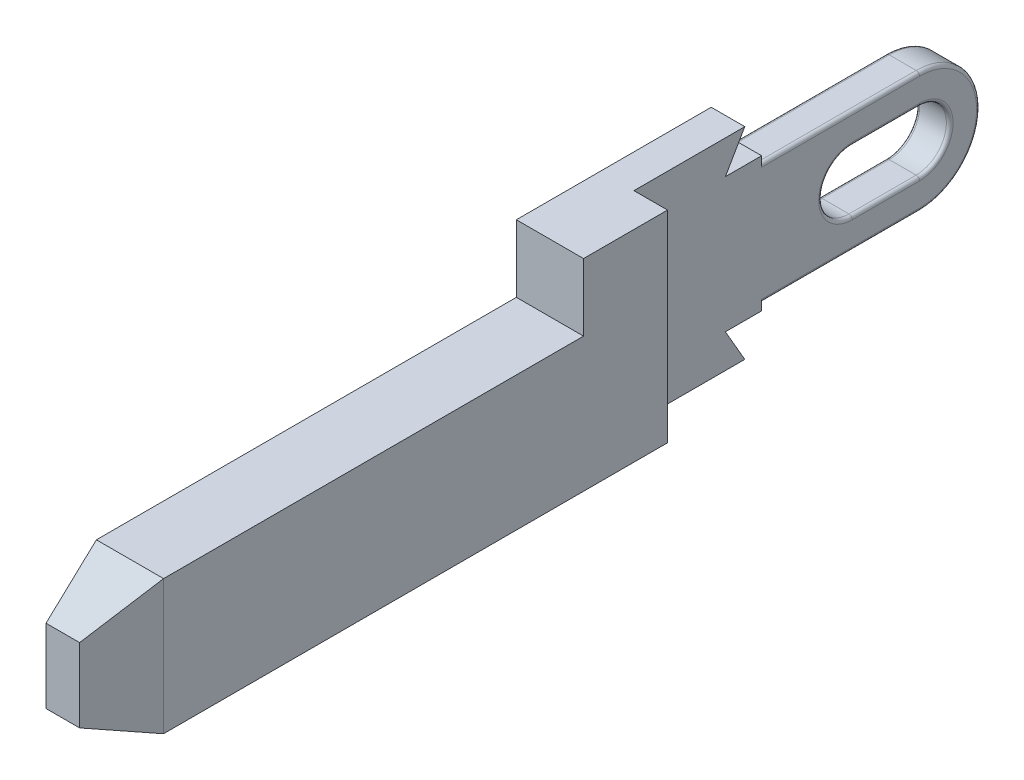
ISO-10303-21;
HEADER;
FILE_DESCRIPTION(('STEP AP214'),'2;1');
FILE_NAME('part.step','',(''),(''),'','','');
FILE_SCHEMA(('AUTOMOTIVE_DESIGN { 1 0 10303 214 1 1 1 1 }'));
ENDSEC;
DATA;
#1=APPLICATION_CONTEXT('core data for automotive mechanical design processes');
#2=APPLICATION_PROTOCOL_DEFINITION('international standard','automotive_design',2000,#1);
#3=PRODUCT_CONTEXT('',#1,'mechanical');
#4=PRODUCT('Part','Part','',(#3));
#5=PRODUCT_RELATED_PRODUCT_CATEGORY('part','',(#4));
#6=PRODUCT_DEFINITION_FORMATION('','',#4);
#7=PRODUCT_DEFINITION_CONTEXT('part definition',#1,'design');
#8=PRODUCT_DEFINITION('design','',#6,#7);
#9=PRODUCT_DEFINITION_SHAPE('','',#8);
#10=(LENGTH_UNIT() NAMED_UNIT(*) SI_UNIT(.MILLI.,.METRE.));
#11=(NAMED_UNIT(*) PLANE_ANGLE_UNIT() SI_UNIT($,.RADIAN.));
#12=(NAMED_UNIT(*) SI_UNIT($,.STERADIAN.) SOLID_ANGLE_UNIT());
#13=UNCERTAINTY_MEASURE_WITH_UNIT(LENGTH_MEASURE(1.E-05),#10,'distance_accuracy_value','');
#14=(GEOMETRIC_REPRESENTATION_CONTEXT(3) GLOBAL_UNCERTAINTY_ASSIGNED_CONTEXT((#13)) GLOBAL_UNIT_ASSIGNED_CONTEXT((#10,
#11,#12)) REPRESENTATION_CONTEXT('',''));
#15=CARTESIAN_POINT('',(0.,0.,0.));
#16=DIRECTION('',(0.,0.,1.));
#17=DIRECTION('',(1.,0.,0.));
#18=AXIS2_PLACEMENT_3D('',#15,#16,#17);
#19=CARTESIAN_POINT('',(2.,-2.,-20.3));
#20=DIRECTION('',(0.,-0.500000000000005,0.866025403784436));
#21=DIRECTION('',(0.,-0.866025403784436,-0.500000000000005));
#22=AXIS2_PLACEMENT_3D('',#19,#20,#21);
#23=PLANE('',#22);
#24=DIRECTION('',(0.,0.866025403784436,0.500000000000005));
#25=VECTOR('',#24,1.);
#26=CARTESIAN_POINT('',(1.,-2.,-20.3));
#27=LINE('',#26,#25);
#28=CARTESIAN_POINT('',(1.,-2.,-20.3));
#29=VERTEX_POINT('',#28);
#30=CARTESIAN_POINT('',(1.,-0.999999999999999,-19.7226497308104));
#31=VERTEX_POINT('',#30);
#32=EDGE_CURVE('E515',#29,#31,#27,.T.);
#33=ORIENTED_EDGE('',*,*,#32,.F.);
#34=DIRECTION('',(-1.,0.,0.));
#35=VECTOR('',#34,1.);
#36=CARTESIAN_POINT('',(2.,-2.,-20.3));
#37=LINE('',#36,#35);
#38=CARTESIAN_POINT('',(0.,-2.,-20.3));
#39=VERTEX_POINT('',#38);
#40=EDGE_CURVE('E329',#29,#39,#37,.T.);
#41=ORIENTED_EDGE('',*,*,#40,.T.);
#42=DIRECTION('',(0.,0.866025403784436,0.500000000000005));
#43=VECTOR('',#42,1.);
#44=CARTESIAN_POINT('',(0.,-2.,-20.3));
#45=LINE('',#44,#43);
#46=CARTESIAN_POINT('',(0.,-0.999999999999999,-19.7226497308104));
#47=VERTEX_POINT('',#46);
#48=EDGE_CURVE('E276',#39,#47,#45,.T.);
#49=ORIENTED_EDGE('',*,*,#48,.T.);
#50=DIRECTION('',(-1.,0.,0.));
#51=VECTOR('',#50,1.);
#52=CARTESIAN_POINT('',(2.,-0.999999999999999,-19.7226497308104));
#53=LINE('',#52,#51);
#54=EDGE_CURVE('E327',#31,#47,#53,.T.);
#55=ORIENTED_EDGE('',*,*,#54,.F.);
#56=EDGE_LOOP('',(#33,#41,#49,#55));
#57=FACE_BOUND('',#56,.T.);
#58=ADVANCED_FACE('F37',(#57),#23,.F.);
#59=CARTESIAN_POINT('',(2.,-0.999999999999999,-19.7226497308104));
#60=DIRECTION('',(0.,1.,0.));
#61=DIRECTION('',(0.,0.,1.));
#62=AXIS2_PLACEMENT_3D('',#59,#60,#61);
#63=PLANE('',#62);
#64=DIRECTION('',(0.,0.,-1.));
#65=VECTOR('',#64,1.);
#66=CARTESIAN_POINT('',(1.,-0.999999999999999,-19.7226497308104));
#67=LINE('',#66,#65);
#68=CARTESIAN_POINT('',(1.,-0.999999999999999,-20.8));
#69=VERTEX_POINT('',#68);
#70=EDGE_CURVE('E513',#31,#69,#67,.T.);
#71=ORIENTED_EDGE('',*,*,#70,.F.);
#72=ORIENTED_EDGE('',*,*,#54,.T.);
#73=DIRECTION('',(0.,0.,-1.));
#74=VECTOR('',#73,1.);
#75=CARTESIAN_POINT('',(0.,-0.999999999999999,-19.7226497308104));
#76=LINE('',#75,#74);
#77=CARTESIAN_POINT('',(0.,-0.999999999999999,-20.8));
#78=VERTEX_POINT('',#77);
#79=EDGE_CURVE('E280',#47,#78,#76,.T.);
#80=ORIENTED_EDGE('',*,*,#79,.T.);
#81=DIRECTION('',(-1.,0.,0.));
#82=VECTOR('',#81,1.);
#83=CARTESIAN_POINT('',(2.,-0.999999999999999,-20.8));
#84=LINE('',#83,#82);
#85=EDGE_CURVE('E325',#69,#78,#84,.T.);
#86=ORIENTED_EDGE('',*,*,#85,.F.);
#87=EDGE_LOOP('',(#71,#72,#80,#86));
#88=FACE_BOUND('',#87,.T.);
#89=ADVANCED_FACE('F578',(#88),#63,.F.);
#90=CARTESIAN_POINT('',(2.,-0.999999999999999,-20.8));
#91=DIRECTION('',(0.,0.,1.));
#92=DIRECTION('',(1.,0.,0.));
#93=AXIS2_PLACEMENT_3D('',#90,#91,#92);
#94=PLANE('',#93);
#95=DIRECTION('',(0.,1.,0.));
#96=VECTOR('',#95,1.);
#97=CARTESIAN_POINT('',(1.,-0.999999999999999,-20.8));
#98=LINE('',#97,#96);
#99=CARTESIAN_POINT('',(1.,-0.699999999999999,-20.8));
#100=VERTEX_POINT('',#99);
#101=EDGE_CURVE('E464',#69,#100,#98,.T.);
#102=ORIENTED_EDGE('',*,*,#101,.F.);
#103=ORIENTED_EDGE('',*,*,#85,.T.);
#104=DIRECTION('',(0.,1.,0.));
#105=VECTOR('',#104,1.);
#106=CARTESIAN_POINT('',(0.,-0.999999999999999,-20.8));
#107=LINE('',#106,#105);
#108=CARTESIAN_POINT('',(0.,-0.699999999999999,-20.8));
#109=VERTEX_POINT('',#108);
#110=EDGE_CURVE('E283',#78,#109,#107,.T.);
#111=ORIENTED_EDGE('',*,*,#110,.T.);
#112=CARTESIAN_POINT('',(0.1,-0.699999999999999,-20.8));
#113=DIRECTION('',(0.,0.,1.));
#114=DIRECTION('',(1.,0.,0.));
#115=AXIS2_PLACEMENT_3D('',#112,#113,#114);
#116=CIRCLE('',#115,0.1);
#117=CARTESIAN_POINT('',(0.1,-0.799999999999999,-20.8));
#118=VERTEX_POINT('',#117);
#119=EDGE_CURVE('E415',#109,#118,#116,.T.);
#120=ORIENTED_EDGE('',*,*,#119,.T.);
#121=DIRECTION('',(-1.,0.,0.));
#122=VECTOR('',#121,1.);
#123=CARTESIAN_POINT('',(2.,-0.799999999999999,-20.8));
#124=LINE('',#123,#122);
#125=CARTESIAN_POINT('',(0.9,-0.799999999999999,-20.8));
#126=VERTEX_POINT('',#125);
#127=EDGE_CURVE('E322',#126,#118,#124,.T.);
#128=ORIENTED_EDGE('',*,*,#127,.F.);
#129=CARTESIAN_POINT('',(0.9,-0.699999999999999,-20.8));
#130=DIRECTION('',(0.,0.,1.));
#131=DIRECTION('',(1.,0.,0.));
#132=AXIS2_PLACEMENT_3D('',#129,#130,#131);
#133=CIRCLE('',#132,0.1);
#134=EDGE_CURVE('E417',#126,#100,#133,.T.);
#135=ORIENTED_EDGE('',*,*,#134,.T.);
#136=EDGE_LOOP('',(#102,#103,#111,#120,#128,#135));
#137=FACE_BOUND('',#136,.T.);
#138=ADVANCED_FACE('F469',(#137),#94,.F.);
#139=CARTESIAN_POINT('',(2.,-0.799999999999999,-20.8));
#140=DIRECTION('',(0.,1.,0.));
#141=DIRECTION('',(0.,0.,1.));
#142=AXIS2_PLACEMENT_3D('',#139,#140,#141);
#143=PLANE('',#142);
#144=ORIENTED_EDGE('',*,*,#127,.T.);
#145=DIRECTION('',(0.,0.,-1.));
#146=VECTOR('',#145,1.);
#147=CARTESIAN_POINT('',(0.1,-0.799999999999999,-25.5));
#148=LINE('',#147,#146);
#149=CARTESIAN_POINT('',(0.1,-0.799999999999999,-25.5));
#150=VERTEX_POINT('',#149);
#151=EDGE_CURVE('E384',#118,#150,#148,.T.);
#152=ORIENTED_EDGE('',*,*,#151,.T.);
#153=DIRECTION('',(-1.,0.,0.));
#154=VECTOR('',#153,1.);
#155=CARTESIAN_POINT('',(2.,-0.799999999999999,-25.5));
#156=LINE('',#155,#154);
#157=CARTESIAN_POINT('',(0.9,-0.799999999999999,-25.5));
#158=VERTEX_POINT('',#157);
#159=EDGE_CURVE('E319',#158,#150,#156,.T.);
#160=ORIENTED_EDGE('',*,*,#159,.F.);
#161=DIRECTION('',(0.,0.,-1.));
#162=VECTOR('',#161,1.);
#163=CARTESIAN_POINT('',(0.9,-0.799999999999999,-20.8));
#164=LINE('',#163,#162);
#165=EDGE_CURVE('E382',#158,#126,#164,.F.);
#166=ORIENTED_EDGE('',*,*,#165,.T.);
#167=EDGE_LOOP('',(#144,#152,#160,#166));
#168=FACE_BOUND('',#167,.T.);
#169=ADVANCED_FACE('F474',(#168),#143,.F.);
#170=CARTESIAN_POINT('',(2.,1.,-25.5));
#171=DIRECTION('',(-1.,0.,0.));
#172=DIRECTION('',(0.,0.,1.));
#173=AXIS2_PLACEMENT_3D('',#170,#171,#172);
#174=CYLINDRICAL_SURFACE('',#173,1.8);
#175=ORIENTED_EDGE('',*,*,#159,.T.);
#176=CARTESIAN_POINT('',(0.1,1.,-25.5));
#177=DIRECTION('',(-1.,0.,0.));
#178=DIRECTION('',(0.,0.,1.));
#179=AXIS2_PLACEMENT_3D('',#176,#177,#178);
#180=CIRCLE('',#179,1.8);
#181=CARTESIAN_POINT('',(0.1,2.8,-25.5));
#182=VERTEX_POINT('',#181);
#183=EDGE_CURVE('E389',#150,#182,#180,.F.);
#184=ORIENTED_EDGE('',*,*,#183,.T.);
#185=DIRECTION('',(-1.,0.,0.));
#186=VECTOR('',#185,1.);
#187=CARTESIAN_POINT('',(2.,2.8,-25.5));
#188=LINE('',#187,#186);
#189=CARTESIAN_POINT('',(0.9,2.8,-25.5));
#190=VERTEX_POINT('',#189);
#191=EDGE_CURVE('E317',#190,#182,#188,.T.);
#192=ORIENTED_EDGE('',*,*,#191,.F.);
#193=CARTESIAN_POINT('',(0.9,1.,-25.5));
#194=DIRECTION('',(1.,0.,0.));
#195=DIRECTION('',(0.,0.,-1.));
#196=AXIS2_PLACEMENT_3D('',#193,#194,#195);
#197=CIRCLE('',#196,1.8);
#198=EDGE_CURVE('E387',#190,#158,#197,.F.);
#199=ORIENTED_EDGE('',*,*,#198,.T.);
#200=EDGE_LOOP('',(#175,#184,#192,#199));
#201=FACE_BOUND('',#200,.T.);
#202=ADVANCED_FACE('F487',(#201),#174,.T.);
#203=CARTESIAN_POINT('',(2.,2.8,-20.8));
#204=DIRECTION('',(0.,-1.,0.));
#205=DIRECTION('',(0.,0.,-1.));
#206=AXIS2_PLACEMENT_3D('',#203,#204,#205);
#207=PLANE('',#206);
#208=ORIENTED_EDGE('',*,*,#191,.T.);
#209=DIRECTION('',(0.,0.,1.));
#210=VECTOR('',#209,1.);
#211=CARTESIAN_POINT('',(0.1,2.8,-20.8));
#212=LINE('',#211,#210);
#213=CARTESIAN_POINT('',(0.1,2.8,-20.8));
#214=VERTEX_POINT('',#213);
#215=EDGE_CURVE('E54',#182,#214,#212,.T.);
#216=ORIENTED_EDGE('',*,*,#215,.T.);
#217=DIRECTION('',(-1.,0.,0.));
#218=VECTOR('',#217,1.);
#219=CARTESIAN_POINT('',(2.,2.8,-20.8));
#220=LINE('',#219,#218);
#221=CARTESIAN_POINT('',(0.9,2.8,-20.8));
#222=VERTEX_POINT('',#221);
#223=EDGE_CURVE('E315',#222,#214,#220,.T.);
#224=ORIENTED_EDGE('',*,*,#223,.F.);
#225=DIRECTION('',(0.,0.,1.));
#226=VECTOR('',#225,1.);
#227=CARTESIAN_POINT('',(0.9,2.8,-25.5));
#228=LINE('',#227,#226);
#229=EDGE_CURVE('E412',#222,#190,#228,.F.);
#230=ORIENTED_EDGE('',*,*,#229,.T.);
#231=EDGE_LOOP('',(#208,#216,#224,#230));
#232=FACE_BOUND('',#231,.T.);
#233=ADVANCED_FACE('F488',(#232),#207,.F.);
#234=CARTESIAN_POINT('',(2.,3.,-20.8));
#235=DIRECTION('',(0.,0.,1.));
#236=DIRECTION('',(1.,0.,0.));
#237=AXIS2_PLACEMENT_3D('',#234,#235,#236);
#238=PLANE('',#237);
#239=DIRECTION('',(0.,1.,0.));
#240=VECTOR('',#239,1.);
#241=CARTESIAN_POINT('',(1.,3.,-20.8));
#242=LINE('',#241,#240);
#243=CARTESIAN_POINT('',(1.,2.7,-20.8));
#244=VERTEX_POINT('',#243);
#245=CARTESIAN_POINT('',(1.,3.,-20.8));
#246=VERTEX_POINT('',#245);
#247=EDGE_CURVE('E461',#244,#246,#242,.T.);
#248=ORIENTED_EDGE('',*,*,#247,.F.);
#249=CARTESIAN_POINT('',(0.9,2.7,-20.8));
#250=DIRECTION('',(0.,0.,1.));
#251=DIRECTION('',(1.,0.,0.));
#252=AXIS2_PLACEMENT_3D('',#249,#250,#251);
#253=CIRCLE('',#252,0.1);
#254=EDGE_CURVE('E11',#244,#222,#253,.T.);
#255=ORIENTED_EDGE('',*,*,#254,.T.);
#256=ORIENTED_EDGE('',*,*,#223,.T.);
#257=CARTESIAN_POINT('',(0.1,2.7,-20.8));
#258=DIRECTION('',(0.,0.,1.));
#259=DIRECTION('',(1.,0.,0.));
#260=AXIS2_PLACEMENT_3D('',#257,#258,#259);
#261=CIRCLE('',#260,0.1);
#262=CARTESIAN_POINT('',(0.,2.7,-20.8));
#263=VERTEX_POINT('',#262);
#264=EDGE_CURVE('E46',#214,#263,#261,.T.);
#265=ORIENTED_EDGE('',*,*,#264,.T.);
#266=DIRECTION('',(0.,1.,0.));
#267=VECTOR('',#266,1.);
#268=CARTESIAN_POINT('',(0.,3.,-20.8));
#269=LINE('',#268,#267);
#270=CARTESIAN_POINT('',(0.,3.,-20.8));
#271=VERTEX_POINT('',#270);
#272=EDGE_CURVE('E285',#263,#271,#269,.T.);
#273=ORIENTED_EDGE('',*,*,#272,.T.);
#274=DIRECTION('',(-1.,0.,0.));
#275=VECTOR('',#274,1.);
#276=CARTESIAN_POINT('',(2.,3.,-20.8));
#277=LINE('',#276,#275);
#278=EDGE_CURVE('E313',#246,#271,#277,.T.);
#279=ORIENTED_EDGE('',*,*,#278,.F.);
#280=EDGE_LOOP('',(#248,#255,#256,#265,#273,#279));
#281=FACE_BOUND('',#280,.T.);
#282=ADVANCED_FACE('F493',(#281),#238,.F.);
#283=CARTESIAN_POINT('',(2.,3.,-19.7226497308104));
#284=DIRECTION('',(0.,-1.,0.));
#285=DIRECTION('',(0.,0.,-1.));
#286=AXIS2_PLACEMENT_3D('',#283,#284,#285);
#287=PLANE('',#286);
#288=DIRECTION('',(0.,0.,1.));
#289=VECTOR('',#288,1.);
#290=CARTESIAN_POINT('',(1.,3.,-19.7226497308104));
#291=LINE('',#290,#289);
#292=CARTESIAN_POINT('',(1.,3.,-19.7226497308104));
#293=VERTEX_POINT('',#292);
#294=EDGE_CURVE('E503',#246,#293,#291,.T.);
#295=ORIENTED_EDGE('',*,*,#294,.F.);
#296=ORIENTED_EDGE('',*,*,#278,.T.);
#297=DIRECTION('',(0.,0.,1.));
#298=VECTOR('',#297,1.);
#299=CARTESIAN_POINT('',(0.,3.,-19.7226497308104));
#300=LINE('',#299,#298);
#301=CARTESIAN_POINT('',(0.,3.,-19.7226497308104));
#302=VERTEX_POINT('',#301);
#303=EDGE_CURVE('E288',#271,#302,#300,.T.);
#304=ORIENTED_EDGE('',*,*,#303,.T.);
#305=DIRECTION('',(-1.,0.,0.));
#306=VECTOR('',#305,1.);
#307=CARTESIAN_POINT('',(2.,3.,-19.7226497308104));
#308=LINE('',#307,#306);
#309=EDGE_CURVE('E311',#293,#302,#308,.T.);
#310=ORIENTED_EDGE('',*,*,#309,.F.);
#311=EDGE_LOOP('',(#295,#296,#304,#310));
#312=FACE_BOUND('',#311,.T.);
#313=ADVANCED_FACE('F502',(#312),#287,.F.);
#314=CARTESIAN_POINT('',(2.,4.,-20.3));
#315=DIRECTION('',(0.,0.500000000000005,0.866025403784436));
#316=DIRECTION('',(0.,-0.866025403784436,0.500000000000005));
#317=AXIS2_PLACEMENT_3D('',#314,#315,#316);
#318=PLANE('',#317);
#319=DIRECTION('',(0.,0.866025403784436,-0.500000000000005));
#320=VECTOR('',#319,1.);
#321=CARTESIAN_POINT('',(1.,4.,-20.3));
#322=LINE('',#321,#320);
#323=CARTESIAN_POINT('',(1.,4.,-20.3));
#324=VERTEX_POINT('',#323);
#325=EDGE_CURVE('E505',#293,#324,#322,.T.);
#326=ORIENTED_EDGE('',*,*,#325,.F.);
#327=ORIENTED_EDGE('',*,*,#309,.T.);
#328=DIRECTION('',(0.,0.866025403784436,-0.500000000000005));
#329=VECTOR('',#328,1.);
#330=CARTESIAN_POINT('',(0.,4.,-20.3));
#331=LINE('',#330,#329);
#332=CARTESIAN_POINT('',(0.,4.,-20.3));
#333=VERTEX_POINT('',#332);
#334=EDGE_CURVE('E291',#302,#333,#331,.T.);
#335=ORIENTED_EDGE('',*,*,#334,.T.);
#336=DIRECTION('',(-1.,0.,0.));
#337=VECTOR('',#336,1.);
#338=CARTESIAN_POINT('',(2.,4.,-20.3));
#339=LINE('',#338,#337);
#340=EDGE_CURVE('E309',#324,#333,#339,.T.);
#341=ORIENTED_EDGE('',*,*,#340,.F.);
#342=EDGE_LOOP('',(#326,#327,#335,#341));
#343=FACE_BOUND('',#342,.T.);
#344=ADVANCED_FACE('F795',(#343),#318,.F.);
#345=CARTESIAN_POINT('',(2.,1.,-23.5));
#346=DIRECTION('',(-1.,0.,0.));
#347=DIRECTION('',(0.,0.,1.));
#348=AXIS2_PLACEMENT_3D('',#345,#346,#347);
#349=CYLINDRICAL_SURFACE('',#348,0.9);
#350=DIRECTION('',(-1.,0.,0.));
#351=VECTOR('',#350,1.);
#352=CARTESIAN_POINT('',(2.,0.100000000000001,-23.5));
#353=LINE('',#352,#351);
#354=CARTESIAN_POINT('',(0.9,0.100000000000001,-23.5));
#355=VERTEX_POINT('',#354);
#356=CARTESIAN_POINT('',(0.1,0.100000000000001,-23.5));
#357=VERTEX_POINT('',#356);
#358=EDGE_CURVE('E277',#355,#357,#353,.T.);
#359=ORIENTED_EDGE('',*,*,#358,.T.);
#360=CARTESIAN_POINT('',(0.1,1.,-23.5));
#361=DIRECTION('',(-1.,0.,0.));
#362=DIRECTION('',(0.,0.,1.));
#363=AXIS2_PLACEMENT_3D('',#360,#361,#362);
#364=CIRCLE('',#363,0.9);
#365=CARTESIAN_POINT('',(0.1,1.9,-23.5));
#366=VERTEX_POINT('',#365);
#367=EDGE_CURVE('E371',#357,#366,#364,.T.);
#368=ORIENTED_EDGE('',*,*,#367,.T.);
#369=DIRECTION('',(-1.,0.,0.));
#370=VECTOR('',#369,1.);
#371=CARTESIAN_POINT('',(2.,1.9,-23.5));
#372=LINE('',#371,#370);
#373=CARTESIAN_POINT('',(0.9,1.9,-23.5));
#374=VERTEX_POINT('',#373);
#375=EDGE_CURVE('E521',#374,#366,#372,.T.);
#376=ORIENTED_EDGE('',*,*,#375,.F.);
#377=CARTESIAN_POINT('',(0.9,1.,-23.5));
#378=DIRECTION('',(1.,0.,0.));
#379=DIRECTION('',(0.,0.,-1.));
#380=AXIS2_PLACEMENT_3D('',#377,#378,#379);
#381=CIRCLE('',#380,0.9);
#382=EDGE_CURVE('E368',#374,#355,#381,.T.);
#383=ORIENTED_EDGE('',*,*,#382,.T.);
#384=EDGE_LOOP('',(#359,#368,#376,#383));
#385=FACE_BOUND('',#384,.T.);
#386=ADVANCED_FACE('F533',(#385),#349,.F.);
#387=CARTESIAN_POINT('',(2.,0.100000000000001,-23.5));
#388=DIRECTION('',(0.,1.,0.));
#389=DIRECTION('',(0.,0.,1.));
#390=AXIS2_PLACEMENT_3D('',#387,#388,#389);
#391=PLANE('',#390);
#392=DIRECTION('',(-1.,0.,0.));
#393=VECTOR('',#392,1.);
#394=CARTESIAN_POINT('',(2.,0.100000000000001,-25.5));
#395=LINE('',#394,#393);
#396=CARTESIAN_POINT('',(0.9,0.100000000000001,-25.5));
#397=VERTEX_POINT('',#396);
#398=CARTESIAN_POINT('',(0.1,0.100000000000001,-25.5));
#399=VERTEX_POINT('',#398);
#400=EDGE_CURVE('E527',#397,#399,#395,.T.);
#401=ORIENTED_EDGE('',*,*,#400,.T.);
#402=DIRECTION('',(0.,0.,-1.));
#403=VECTOR('',#402,1.);
#404=CARTESIAN_POINT('',(0.1,0.100000000000001,-23.5));
#405=LINE('',#404,#403);
#406=EDGE_CURVE('E410',#399,#357,#405,.F.);
#407=ORIENTED_EDGE('',*,*,#406,.T.);
#408=ORIENTED_EDGE('',*,*,#358,.F.);
#409=DIRECTION('',(0.,0.,-1.));
#410=VECTOR('',#409,1.);
#411=CARTESIAN_POINT('',(0.9,0.100000000000001,-23.5));
#412=LINE('',#411,#410);
#413=EDGE_CURVE('E408',#355,#397,#412,.T.);
#414=ORIENTED_EDGE('',*,*,#413,.T.);
#415=EDGE_LOOP('',(#401,#407,#408,#414));
#416=FACE_BOUND('',#415,.T.);
#417=ADVANCED_FACE('F810',(#416),#391,.T.);
#418=CARTESIAN_POINT('',(2.,1.,-25.5));
#419=DIRECTION('',(-1.,0.,0.));
#420=DIRECTION('',(0.,0.,1.));
#421=AXIS2_PLACEMENT_3D('',#418,#419,#420);
#422=CYLINDRICAL_SURFACE('',#421,0.9);
#423=DIRECTION('',(-1.,0.,0.));
#424=VECTOR('',#423,1.);
#425=CARTESIAN_POINT('',(2.,1.9,-25.5));
#426=LINE('',#425,#424);
#427=CARTESIAN_POINT('',(0.9,1.9,-25.5));
#428=VERTEX_POINT('',#427);
#429=CARTESIAN_POINT('',(0.1,1.9,-25.5));
#430=VERTEX_POINT('',#429);
#431=EDGE_CURVE('E524',#428,#430,#426,.T.);
#432=ORIENTED_EDGE('',*,*,#431,.T.);
#433=CARTESIAN_POINT('',(0.1,1.,-25.5));
#434=DIRECTION('',(-1.,0.,0.));
#435=DIRECTION('',(0.,0.,1.));
#436=AXIS2_PLACEMENT_3D('',#433,#434,#435);
#437=CIRCLE('',#436,0.9);
#438=EDGE_CURVE('E380',#430,#399,#437,.T.);
#439=ORIENTED_EDGE('',*,*,#438,.T.);
#440=ORIENTED_EDGE('',*,*,#400,.F.);
#441=CARTESIAN_POINT('',(0.9,1.,-25.5));
#442=DIRECTION('',(1.,0.,0.));
#443=DIRECTION('',(0.,0.,-1.));
#444=AXIS2_PLACEMENT_3D('',#441,#442,#443);
#445=CIRCLE('',#444,0.9);
#446=EDGE_CURVE('E378',#397,#428,#445,.T.);
#447=ORIENTED_EDGE('',*,*,#446,.T.);
#448=EDGE_LOOP('',(#432,#439,#440,#447));
#449=FACE_BOUND('',#448,.T.);
#450=ADVANCED_FACE('F560',(#449),#422,.F.);
#451=CARTESIAN_POINT('',(2.,1.9,-23.5));
#452=DIRECTION('',(0.,-1.,0.));
#453=DIRECTION('',(0.,0.,-1.));
#454=AXIS2_PLACEMENT_3D('',#451,#452,#453);
#455=PLANE('',#454);
#456=ORIENTED_EDGE('',*,*,#375,.T.);
#457=DIRECTION('',(0.,0.,1.));
#458=VECTOR('',#457,1.);
#459=CARTESIAN_POINT('',(0.1,1.9,-23.5));
#460=LINE('',#459,#458);
#461=EDGE_CURVE('E376',#366,#430,#460,.F.);
#462=ORIENTED_EDGE('',*,*,#461,.T.);
#463=ORIENTED_EDGE('',*,*,#431,.F.);
#464=DIRECTION('',(0.,0.,1.));
#465=VECTOR('',#464,1.);
#466=CARTESIAN_POINT('',(0.9,1.9,-23.5));
#467=LINE('',#466,#465);
#468=EDGE_CURVE('E374',#428,#374,#467,.T.);
#469=ORIENTED_EDGE('',*,*,#468,.T.);
#470=EDGE_LOOP('',(#456,#462,#463,#469));
#471=FACE_BOUND('',#470,.T.);
#472=ADVANCED_FACE('F556',(#471),#455,.T.);
#473=CARTESIAN_POINT('',(2.,1.,-25.5));
#474=DIRECTION('',(-1.,0.,0.));
#475=DIRECTION('',(0.,0.,1.));
#476=AXIS2_PLACEMENT_3D('',#473,#474,#475);
#477=PLANE('',#476);
#478=DIRECTION('',(0.,0.,1.));
#479=VECTOR('',#478,1.);
#480=CARTESIAN_POINT('',(2.,2.,-2.));
#481=LINE('',#480,#479);
#482=CARTESIAN_POINT('',(2.,2.,-14.5));
#483=VERTEX_POINT('',#482);
#484=CARTESIAN_POINT('',(2.,2.,-2.));
#485=VERTEX_POINT('',#484);
#486=EDGE_CURVE('E265',#483,#485,#481,.T.);
#487=ORIENTED_EDGE('',*,*,#486,.T.);
#488=DIRECTION('',(0.,-1.,0.));
#489=VECTOR('',#488,1.);
#490=CARTESIAN_POINT('',(2.,1.,-2.00000000000003));
#491=LINE('',#490,#489);
#492=CARTESIAN_POINT('',(2.,-2.,-2.));
#493=VERTEX_POINT('',#492);
#494=EDGE_CURVE('E245',#485,#493,#491,.T.);
#495=ORIENTED_EDGE('',*,*,#494,.T.);
#496=DIRECTION('',(0.,0.,-1.));
#497=VECTOR('',#496,1.);
#498=CARTESIAN_POINT('',(2.,-2.,-2.));
#499=LINE('',#498,#497);
#500=CARTESIAN_POINT('',(2.,-2.,-17.));
#501=VERTEX_POINT('',#500);
#502=EDGE_CURVE('E256',#493,#501,#499,.T.);
#503=ORIENTED_EDGE('',*,*,#502,.T.);
#504=DIRECTION('',(0.,-1.,0.));
#505=VECTOR('',#504,1.);
#506=CARTESIAN_POINT('',(2.,5.63012774019272,-17.));
#507=LINE('',#506,#505);
#508=CARTESIAN_POINT('',(2.,4.,-17.));
#509=VERTEX_POINT('',#508);
#510=EDGE_CURVE('E238',#509,#501,#507,.T.);
#511=ORIENTED_EDGE('',*,*,#510,.F.);
#512=DIRECTION('',(0.,0.,1.));
#513=VECTOR('',#512,1.);
#514=CARTESIAN_POINT('',(2.,4.,-14.5));
#515=LINE('',#514,#513);
#516=CARTESIAN_POINT('',(2.,4.,-14.5));
#517=VERTEX_POINT('',#516);
#518=EDGE_CURVE('E252',#509,#517,#515,.T.);
#519=ORIENTED_EDGE('',*,*,#518,.T.);
#520=DIRECTION('',(0.,-1.,0.));
#521=VECTOR('',#520,1.);
#522=CARTESIAN_POINT('',(2.,2.,-14.5));
#523=LINE('',#522,#521);
#524=EDGE_CURVE('E263',#517,#483,#523,.T.);
#525=ORIENTED_EDGE('',*,*,#524,.T.);
#526=EDGE_LOOP('',(#487,#495,#503,#511,#519,#525));
#527=FACE_BOUND('',#526,.T.);
#528=ADVANCED_FACE('F251',(#527),#477,.F.);
#529=CARTESIAN_POINT('',(0.,1.,-25.5));
#530=DIRECTION('',(-1.,0.,0.));
#531=DIRECTION('',(0.,0.,1.));
#532=AXIS2_PLACEMENT_3D('',#529,#530,#531);
#533=PLANE('',#532);
#534=DIRECTION('',(0.,0.,1.));
#535=VECTOR('',#534,1.);
#536=CARTESIAN_POINT('',(0.,2.,-25.5));
#537=LINE('',#536,#535);
#538=CARTESIAN_POINT('',(0.,2.,-25.5));
#539=VERTEX_POINT('',#538);
#540=CARTESIAN_POINT('',(0.,2.,-23.5));
#541=VERTEX_POINT('',#540);
#542=EDGE_CURVE('E363',#539,#541,#537,.T.);
#543=ORIENTED_EDGE('',*,*,#542,.T.);
#544=CARTESIAN_POINT('',(0.,1.,-23.5));
#545=DIRECTION('',(-1.,0.,0.));
#546=DIRECTION('',(0.,0.,1.));
#547=AXIS2_PLACEMENT_3D('',#544,#545,#546);
#548=CIRCLE('',#547,1.);
#549=CARTESIAN_POINT('',(0.,0.,-23.5));
#550=VERTEX_POINT('',#549);
#551=EDGE_CURVE('E365',#541,#550,#548,.F.);
#552=ORIENTED_EDGE('',*,*,#551,.T.);
#553=DIRECTION('',(0.,0.,-1.));
#554=VECTOR('',#553,1.);
#555=CARTESIAN_POINT('',(0.,0.,-25.5));
#556=LINE('',#555,#554);
#557=CARTESIAN_POINT('',(0.,0.,-25.5));
#558=VERTEX_POINT('',#557);
#559=EDGE_CURVE('E359',#550,#558,#556,.T.);
#560=ORIENTED_EDGE('',*,*,#559,.T.);
#561=CARTESIAN_POINT('',(0.,1.,-25.5));
#562=DIRECTION('',(-1.,0.,0.));
#563=DIRECTION('',(0.,0.,1.));
#564=AXIS2_PLACEMENT_3D('',#561,#562,#563);
#565=CIRCLE('',#564,1.);
#566=EDGE_CURVE('E361',#558,#539,#565,.F.);
#567=ORIENTED_EDGE('',*,*,#566,.T.);
#568=EDGE_LOOP('',(#543,#552,#560,#567));
#569=FACE_BOUND('',#568,.T.);
#570=DIRECTION('',(0.,0.,-1.));
#571=VECTOR('',#570,1.);
#572=CARTESIAN_POINT('',(0.,-0.699999999999999,-20.8));
#573=LINE('',#572,#571);
#574=CARTESIAN_POINT('',(0.,-0.699999999999999,-25.5));
#575=VERTEX_POINT('',#574);
#576=EDGE_CURVE('E356',#575,#109,#573,.F.);
#577=ORIENTED_EDGE('',*,*,#576,.T.);
#578=ORIENTED_EDGE('',*,*,#110,.F.);
#579=ORIENTED_EDGE('',*,*,#79,.F.);
#580=ORIENTED_EDGE('',*,*,#48,.F.);
#581=DIRECTION('',(0.,0.,-1.));
#582=VECTOR('',#581,1.);
#583=CARTESIAN_POINT('',(0.,-2.,-2.));
#584=LINE('',#583,#582);
#585=CARTESIAN_POINT('',(0.,-2.,-2.));
#586=VERTEX_POINT('',#585);
#587=EDGE_CURVE('E273',#586,#39,#584,.T.);
#588=ORIENTED_EDGE('',*,*,#587,.F.);
#589=DIRECTION('',(0.,1.,0.));
#590=VECTOR('',#589,1.);
#591=CARTESIAN_POINT('',(0.,1.1,-2.00000000000003));
#592=LINE('',#591,#590);
#593=CARTESIAN_POINT('',(0.,2.,-2.));
#594=VERTEX_POINT('',#593);
#595=EDGE_CURVE('E348',#586,#594,#592,.T.);
#596=ORIENTED_EDGE('',*,*,#595,.T.);
#597=DIRECTION('',(0.,0.,1.));
#598=VECTOR('',#597,1.);
#599=CARTESIAN_POINT('',(0.,2.,-2.));
#600=LINE('',#599,#598);
#601=CARTESIAN_POINT('',(0.,2.,-14.5));
#602=VERTEX_POINT('',#601);
#603=EDGE_CURVE('E267',#602,#594,#600,.T.);
#604=ORIENTED_EDGE('',*,*,#603,.F.);
#605=DIRECTION('',(0.,-1.,0.));
#606=VECTOR('',#605,1.);
#607=CARTESIAN_POINT('',(0.,2.,-14.5));
#608=LINE('',#607,#606);
#609=CARTESIAN_POINT('',(0.,4.,-14.5));
#610=VERTEX_POINT('',#609);
#611=EDGE_CURVE('E296',#610,#602,#608,.T.);
#612=ORIENTED_EDGE('',*,*,#611,.F.);
#613=DIRECTION('',(0.,0.,1.));
#614=VECTOR('',#613,1.);
#615=CARTESIAN_POINT('',(0.,4.,-14.5));
#616=LINE('',#615,#614);
#617=EDGE_CURVE('E294',#333,#610,#616,.T.);
#618=ORIENTED_EDGE('',*,*,#617,.F.);
#619=ORIENTED_EDGE('',*,*,#334,.F.);
#620=ORIENTED_EDGE('',*,*,#303,.F.);
#621=ORIENTED_EDGE('',*,*,#272,.F.);
#622=DIRECTION('',(0.,0.,1.));
#623=VECTOR('',#622,1.);
#624=CARTESIAN_POINT('',(0.,2.7,-25.5));
#625=LINE('',#624,#623);
#626=CARTESIAN_POINT('',(0.,2.7,-25.5));
#627=VERTEX_POINT('',#626);
#628=EDGE_CURVE('E352',#263,#627,#625,.F.);
#629=ORIENTED_EDGE('',*,*,#628,.T.);
#630=CARTESIAN_POINT('',(0.,1.,-25.5));
#631=DIRECTION('',(-1.,0.,0.));
#632=DIRECTION('',(0.,0.,1.));
#633=AXIS2_PLACEMENT_3D('',#630,#631,#632);
#634=CIRCLE('',#633,1.7);
#635=EDGE_CURVE('E354',#627,#575,#634,.T.);
#636=ORIENTED_EDGE('',*,*,#635,.T.);
#637=EDGE_LOOP('',(#577,#578,#579,#580,#588,#596,#604,#612,#618,#619,#620,#621,#629,#636));
#638=FACE_BOUND('',#637,.T.);
#639=ADVANCED_FACE('F498',(#569,#638),#533,.T.);
#640=CARTESIAN_POINT('',(2.,-1.1,0.));
#641=DIRECTION('',(0.,0.911921505175107,-0.410364677328798));
#642=DIRECTION('',(0.,0.410364677328798,0.911921505175107));
#643=AXIS2_PLACEMENT_3D('',#640,#641,#642);
#644=PLANE('',#643);
#645=DIRECTION('',(-1.,0.,0.));
#646=VECTOR('',#645,1.);
#647=CARTESIAN_POINT('',(2.,-1.1,0.));
#648=LINE('',#647,#646);
#649=CARTESIAN_POINT('',(1.5,-1.1,0.));
#650=VERTEX_POINT('',#649);
#651=CARTESIAN_POINT('',(0.5,-1.1,0.));
#652=VERTEX_POINT('',#651);
#653=EDGE_CURVE('E246',#650,#652,#648,.T.);
#654=ORIENTED_EDGE('',*,*,#653,.T.);
#655=DIRECTION('',(-0.222277112237191,-0.400098802026949,-0.889108448948775));
#656=VECTOR('',#655,1.);
#657=CARTESIAN_POINT('',(0.597826086956521,-0.923913043478261,0.391304347826087));
#658=LINE('',#657,#656);
#659=EDGE_CURVE('E346',#652,#586,#658,.T.);
#660=ORIENTED_EDGE('',*,*,#659,.T.);
#661=DIRECTION('',(-1.,0.,0.));
#662=VECTOR('',#661,1.);
#663=CARTESIAN_POINT('',(2.,-2.,-2.));
#664=LINE('',#663,#662);
#665=EDGE_CURVE('E331',#493,#586,#664,.T.);
#666=ORIENTED_EDGE('',*,*,#665,.F.);
#667=DIRECTION('',(0.222277112237191,-0.400098802026949,-0.889108448948775));
#668=VECTOR('',#667,1.);
#669=CARTESIAN_POINT('',(1.73320158102767,-1.51976284584981,-0.932806324110695));
#670=LINE('',#669,#668);
#671=EDGE_CURVE('E337',#493,#650,#670,.F.);
#672=ORIENTED_EDGE('',*,*,#671,.T.);
#673=EDGE_LOOP('',(#654,#660,#666,#672));
#674=FACE_BOUND('',#673,.T.);
#675=ADVANCED_FACE('F592',(#674),#644,.F.);
#676=CARTESIAN_POINT('',(2.,-2.,-2.));
#677=DIRECTION('',(0.,1.,0.));
#678=DIRECTION('',(0.,0.,1.));
#679=AXIS2_PLACEMENT_3D('',#676,#677,#678);
#680=PLANE('',#679);
#681=DIRECTION('',(0.,0.,-1.));
#682=VECTOR('',#681,1.);
#683=CARTESIAN_POINT('',(1.,-2.,-2.));
#684=LINE('',#683,#682);
#685=CARTESIAN_POINT('',(1.,-2.,-17.));
#686=VERTEX_POINT('',#685);
#687=EDGE_CURVE('E517',#686,#29,#684,.T.);
#688=ORIENTED_EDGE('',*,*,#687,.F.);
#689=DIRECTION('',(1.,0.,0.));
#690=VECTOR('',#689,1.);
#691=CARTESIAN_POINT('',(2.,-2.,-17.));
#692=LINE('',#691,#690);
#693=EDGE_CURVE('E519',#686,#501,#692,.T.);
#694=ORIENTED_EDGE('',*,*,#693,.T.);
#695=ORIENTED_EDGE('',*,*,#502,.F.);
#696=ORIENTED_EDGE('',*,*,#665,.T.);
#697=ORIENTED_EDGE('',*,*,#587,.T.);
#698=ORIENTED_EDGE('',*,*,#40,.F.);
#699=EDGE_LOOP('',(#688,#694,#695,#696,#697,#698));
#700=FACE_BOUND('',#699,.T.);
#701=ADVANCED_FACE('F589',(#700),#680,.F.);
#702=CARTESIAN_POINT('',(2.,4.,-14.5));
#703=DIRECTION('',(0.,-1.,0.));
#704=DIRECTION('',(0.,0.,-1.));
#705=AXIS2_PLACEMENT_3D('',#702,#703,#704);
#706=PLANE('',#705);
#707=ORIENTED_EDGE('',*,*,#518,.F.);
#708=DIRECTION('',(-1.,0.,0.));
#709=VECTOR('',#708,1.);
#710=CARTESIAN_POINT('',(2.,4.,-17.));
#711=LINE('',#710,#709);
#712=CARTESIAN_POINT('',(1.,4.,-17.));
#713=VERTEX_POINT('',#712);
#714=EDGE_CURVE('E235',#509,#713,#711,.T.);
#715=ORIENTED_EDGE('',*,*,#714,.T.);
#716=DIRECTION('',(0.,0.,1.));
#717=VECTOR('',#716,1.);
#718=CARTESIAN_POINT('',(1.,4.,-14.5));
#719=LINE('',#718,#717);
#720=EDGE_CURVE('E508',#324,#713,#719,.T.);
#721=ORIENTED_EDGE('',*,*,#720,.F.);
#722=ORIENTED_EDGE('',*,*,#340,.T.);
#723=ORIENTED_EDGE('',*,*,#617,.T.);
#724=DIRECTION('',(-1.,0.,0.));
#725=VECTOR('',#724,1.);
#726=CARTESIAN_POINT('',(2.,4.,-14.5));
#727=LINE('',#726,#725);
#728=EDGE_CURVE('E261',#517,#610,#727,.T.);
#729=ORIENTED_EDGE('',*,*,#728,.F.);
#730=EDGE_LOOP('',(#707,#715,#721,#722,#723,#729));
#731=FACE_BOUND('',#730,.T.);
#732=ADVANCED_FACE('F259',(#731),#706,.F.);
#733=CARTESIAN_POINT('',(2.,2.,-14.5));
#734=DIRECTION('',(0.,0.,-1.));
#735=DIRECTION('',(-1.,0.,0.));
#736=AXIS2_PLACEMENT_3D('',#733,#734,#735);
#737=PLANE('',#736);
#738=ORIENTED_EDGE('',*,*,#611,.T.);
#739=DIRECTION('',(-1.,0.,0.));
#740=VECTOR('',#739,1.);
#741=CARTESIAN_POINT('',(2.,2.,-14.5));
#742=LINE('',#741,#740);
#743=EDGE_CURVE('E305',#483,#602,#742,.T.);
#744=ORIENTED_EDGE('',*,*,#743,.F.);
#745=ORIENTED_EDGE('',*,*,#524,.F.);
#746=ORIENTED_EDGE('',*,*,#728,.T.);
#747=EDGE_LOOP('',(#738,#744,#745,#746));
#748=FACE_BOUND('',#747,.T.);
#749=ADVANCED_FACE('F860',(#748),#737,.F.);
#750=CARTESIAN_POINT('',(2.,2.,-2.));
#751=DIRECTION('',(0.,-1.,0.));
#752=DIRECTION('',(0.,0.,-1.));
#753=AXIS2_PLACEMENT_3D('',#750,#751,#752);
#754=PLANE('',#753);
#755=ORIENTED_EDGE('',*,*,#603,.T.);
#756=DIRECTION('',(-1.,0.,0.));
#757=VECTOR('',#756,1.);
#758=CARTESIAN_POINT('',(2.,2.,-2.));
#759=LINE('',#758,#757);
#760=EDGE_CURVE('E302',#485,#594,#759,.T.);
#761=ORIENTED_EDGE('',*,*,#760,.F.);
#762=ORIENTED_EDGE('',*,*,#486,.F.);
#763=ORIENTED_EDGE('',*,*,#743,.T.);
#764=EDGE_LOOP('',(#755,#761,#762,#763));
#765=FACE_BOUND('',#764,.T.);
#766=ADVANCED_FACE('F850',(#765),#754,.F.);
#767=CARTESIAN_POINT('',(2.,1.1,0.));
#768=DIRECTION('',(0.,-0.911921505175107,-0.410364677328798));
#769=DIRECTION('',(0.,0.410364677328798,-0.911921505175107));
#770=AXIS2_PLACEMENT_3D('',#767,#768,#769);
#771=PLANE('',#770);
#772=ORIENTED_EDGE('',*,*,#760,.T.);
#773=DIRECTION('',(0.222277112237191,-0.400098802026949,0.889108448948775));
#774=VECTOR('',#773,1.);
#775=CARTESIAN_POINT('',(0.597826086956521,0.923913043478261,0.391304347826087));
#776=LINE('',#775,#774);
#777=CARTESIAN_POINT('',(0.5,1.1,0.));
#778=VERTEX_POINT('',#777);
#779=EDGE_CURVE('E350',#594,#778,#776,.T.);
#780=ORIENTED_EDGE('',*,*,#779,.T.);
#781=DIRECTION('',(-1.,0.,0.));
#782=VECTOR('',#781,1.);
#783=CARTESIAN_POINT('',(2.,1.1,0.));
#784=LINE('',#783,#782);
#785=CARTESIAN_POINT('',(1.5,1.1,0.));
#786=VERTEX_POINT('',#785);
#787=EDGE_CURVE('E272',#786,#778,#784,.T.);
#788=ORIENTED_EDGE('',*,*,#787,.F.);
#789=DIRECTION('',(-0.222277112237191,-0.400098802026949,0.889108448948775));
#790=VECTOR('',#789,1.);
#791=CARTESIAN_POINT('',(1.91106719367589,1.83992094861661,-1.64426877470358));
#792=LINE('',#791,#790);
#793=EDGE_CURVE('E341',#786,#485,#792,.F.);
#794=ORIENTED_EDGE('',*,*,#793,.T.);
#795=EDGE_LOOP('',(#772,#780,#788,#794));
#796=FACE_BOUND('',#795,.T.);
#797=ADVANCED_FACE('F838',(#796),#771,.F.);
#798=CARTESIAN_POINT('',(2.,0.,0.));
#799=DIRECTION('',(0.,0.,-1.));
#800=DIRECTION('',(-1.,0.,0.));
#801=AXIS2_PLACEMENT_3D('',#798,#799,#800);
#802=PLANE('',#801);
#803=ORIENTED_EDGE('',*,*,#787,.T.);
#804=DIRECTION('',(0.,-1.,0.));
#805=VECTOR('',#804,1.);
#806=CARTESIAN_POINT('',(0.5,-1.1,0.));
#807=LINE('',#806,#805);
#808=EDGE_CURVE('E343',#778,#652,#807,.T.);
#809=ORIENTED_EDGE('',*,*,#808,.T.);
#810=ORIENTED_EDGE('',*,*,#653,.F.);
#811=DIRECTION('',(0.,1.,0.));
#812=VECTOR('',#811,1.);
#813=CARTESIAN_POINT('',(1.5,0.,0.));
#814=LINE('',#813,#812);
#815=EDGE_CURVE('E339',#650,#786,#814,.T.);
#816=ORIENTED_EDGE('',*,*,#815,.T.);
#817=EDGE_LOOP('',(#803,#809,#810,#816));
#818=FACE_BOUND('',#817,.T.);
#819=ADVANCED_FACE('F742',(#818),#802,.F.);
#820=CARTESIAN_POINT('',(1.,5.63012774019272,-17.));
#821=DIRECTION('',(0.,0.,1.));
#822=DIRECTION('',(1.,0.,0.));
#823=AXIS2_PLACEMENT_3D('',#820,#821,#822);
#824=PLANE('',#823);
#825=DIRECTION('',(0.,-1.,0.));
#826=VECTOR('',#825,1.);
#827=CARTESIAN_POINT('',(1.,5.63012774019272,-17.));
#828=LINE('',#827,#826);
#829=EDGE_CURVE('E241',#713,#686,#828,.T.);
#830=ORIENTED_EDGE('',*,*,#829,.F.);
#831=ORIENTED_EDGE('',*,*,#714,.F.);
#832=ORIENTED_EDGE('',*,*,#510,.T.);
#833=ORIENTED_EDGE('',*,*,#693,.F.);
#834=EDGE_LOOP('',(#830,#831,#832,#833));
#835=FACE_BOUND('',#834,.T.);
#836=ADVANCED_FACE('F237',(#835),#824,.F.);
#837=CARTESIAN_POINT('',(1.,0.,0.));
#838=DIRECTION('',(1.,0.,0.));
#839=DIRECTION('',(0.,0.,-1.));
#840=AXIS2_PLACEMENT_3D('',#837,#838,#839);
#841=PLANE('',#840);
#842=DIRECTION('',(0.,0.,-1.));
#843=VECTOR('',#842,1.);
#844=CARTESIAN_POINT('',(1.,0.,0.));
#845=LINE('',#844,#843);
#846=CARTESIAN_POINT('',(1.,0.,-25.5));
#847=VERTEX_POINT('',#846);
#848=CARTESIAN_POINT('',(1.,0.,-23.5));
#849=VERTEX_POINT('',#848);
#850=EDGE_CURVE('E399',#847,#849,#845,.F.);
#851=ORIENTED_EDGE('',*,*,#850,.T.);
#852=CARTESIAN_POINT('',(1.,1.,-23.5));
#853=DIRECTION('',(1.,0.,0.));
#854=DIRECTION('',(0.,0.,-1.));
#855=AXIS2_PLACEMENT_3D('',#852,#853,#854);
#856=CIRCLE('',#855,1.);
#857=CARTESIAN_POINT('',(1.,2.,-23.5));
#858=VERTEX_POINT('',#857);
#859=EDGE_CURVE('E405',#849,#858,#856,.F.);
#860=ORIENTED_EDGE('',*,*,#859,.T.);
#861=DIRECTION('',(0.,0.,1.));
#862=VECTOR('',#861,1.);
#863=CARTESIAN_POINT('',(1.,2.,0.));
#864=LINE('',#863,#862);
#865=CARTESIAN_POINT('',(1.,2.,-25.5));
#866=VERTEX_POINT('',#865);
#867=EDGE_CURVE('E403',#858,#866,#864,.F.);
#868=ORIENTED_EDGE('',*,*,#867,.T.);
#869=CARTESIAN_POINT('',(1.,1.,-25.5));
#870=DIRECTION('',(1.,0.,0.));
#871=DIRECTION('',(0.,0.,-1.));
#872=AXIS2_PLACEMENT_3D('',#869,#870,#871);
#873=CIRCLE('',#872,1.);
#874=EDGE_CURVE('E401',#866,#847,#873,.F.);
#875=ORIENTED_EDGE('',*,*,#874,.T.);
#876=EDGE_LOOP('',(#851,#860,#868,#875));
#877=FACE_BOUND('',#876,.T.);
#878=ORIENTED_EDGE('',*,*,#101,.T.);
#879=DIRECTION('',(0.,0.,-1.));
#880=VECTOR('',#879,1.);
#881=CARTESIAN_POINT('',(1.,-0.699999999999999,-25.5));
#882=LINE('',#881,#880);
#883=CARTESIAN_POINT('',(1.,-0.699999999999999,-25.5));
#884=VERTEX_POINT('',#883);
#885=EDGE_CURVE('E396',#100,#884,#882,.T.);
#886=ORIENTED_EDGE('',*,*,#885,.T.);
#887=CARTESIAN_POINT('',(1.,1.,-25.5));
#888=DIRECTION('',(1.,0.,0.));
#889=DIRECTION('',(0.,0.,-1.));
#890=AXIS2_PLACEMENT_3D('',#887,#888,#889);
#891=CIRCLE('',#890,1.7);
#892=CARTESIAN_POINT('',(1.,2.7,-25.5));
#893=VERTEX_POINT('',#892);
#894=EDGE_CURVE('E394',#884,#893,#891,.T.);
#895=ORIENTED_EDGE('',*,*,#894,.T.);
#896=DIRECTION('',(0.,0.,1.));
#897=VECTOR('',#896,1.);
#898=CARTESIAN_POINT('',(1.,2.7,-20.8));
#899=LINE('',#898,#897);
#900=EDGE_CURVE('E391',#893,#244,#899,.T.);
#901=ORIENTED_EDGE('',*,*,#900,.T.);
#902=ORIENTED_EDGE('',*,*,#247,.T.);
#903=ORIENTED_EDGE('',*,*,#294,.T.);
#904=ORIENTED_EDGE('',*,*,#325,.T.);
#905=ORIENTED_EDGE('',*,*,#720,.T.);
#906=ORIENTED_EDGE('',*,*,#829,.T.);
#907=ORIENTED_EDGE('',*,*,#687,.T.);
#908=ORIENTED_EDGE('',*,*,#32,.T.);
#909=ORIENTED_EDGE('',*,*,#70,.T.);
#910=EDGE_LOOP('',(#878,#886,#895,#901,#902,#903,#904,#905,#906,#907,#908,#909));
#911=FACE_BOUND('',#910,.T.);
#912=ADVANCED_FACE('F460',(#877,#911),#841,.T.);
#913=CARTESIAN_POINT('',(2.,1.,-2.00000000000003));
#914=DIRECTION('',(-0.970142500145333,0.,-0.24253562503633));
#915=DIRECTION('',(0.,-1.,0.));
#916=AXIS2_PLACEMENT_3D('',#913,#914,#915);
#917=PLANE('',#916);
#918=ORIENTED_EDGE('',*,*,#793,.F.);
#919=ORIENTED_EDGE('',*,*,#815,.F.);
#920=ORIENTED_EDGE('',*,*,#671,.F.);
#921=ORIENTED_EDGE('',*,*,#494,.F.);
#922=EDGE_LOOP('',(#918,#919,#920,#921));
#923=FACE_BOUND('',#922,.T.);
#924=ADVANCED_FACE('F573',(#923),#917,.F.);
#925=CARTESIAN_POINT('',(0.5,0.,0.));
#926=DIRECTION('',(-0.970142500145333,0.,0.24253562503633));
#927=DIRECTION('',(0.,1.,0.));
#928=AXIS2_PLACEMENT_3D('',#925,#926,#927);
#929=PLANE('',#928);
#930=ORIENTED_EDGE('',*,*,#779,.F.);
#931=ORIENTED_EDGE('',*,*,#595,.F.);
#932=ORIENTED_EDGE('',*,*,#659,.F.);
#933=ORIENTED_EDGE('',*,*,#808,.F.);
#934=EDGE_LOOP('',(#930,#931,#932,#933));
#935=FACE_BOUND('',#934,.T.);
#936=ADVANCED_FACE('F566',(#935),#929,.T.);
#937=CARTESIAN_POINT('',(0.1,1.,-25.5));
#938=DIRECTION('',(-1.,0.,0.));
#939=DIRECTION('',(0.,0.,1.));
#940=AXIS2_PLACEMENT_3D('',#937,#938,#939);
#941=TOROIDAL_SURFACE('',#940,1.,0.1);
#942=CARTESIAN_POINT('',(0.1,0.,-25.5));
#943=DIRECTION('',(0.,0.,1.));
#944=DIRECTION('',(1.,0.,0.));
#945=AXIS2_PLACEMENT_3D('',#942,#943,#944);
#946=CIRCLE('',#945,0.1);
#947=EDGE_CURVE('E427',#399,#558,#946,.T.);
#948=ORIENTED_EDGE('',*,*,#947,.F.);
#949=ORIENTED_EDGE('',*,*,#438,.F.);
#950=CARTESIAN_POINT('',(0.1,2.,-25.5));
#951=DIRECTION('',(0.,0.,1.));
#952=DIRECTION('',(1.,0.,0.));
#953=AXIS2_PLACEMENT_3D('',#950,#951,#952);
#954=CIRCLE('',#953,0.1);
#955=EDGE_CURVE('E257',#539,#430,#954,.T.);
#956=ORIENTED_EDGE('',*,*,#955,.F.);
#957=ORIENTED_EDGE('',*,*,#566,.F.);
#958=EDGE_LOOP('',(#948,#949,#956,#957));
#959=FACE_BOUND('',#958,.T.);
#960=ADVANCED_FACE('F564',(#959),#941,.T.);
#961=CARTESIAN_POINT('',(0.1,2.,-25.5));
#962=DIRECTION('',(0.,0.,1.));
#963=DIRECTION('',(0.,-1.,0.));
#964=AXIS2_PLACEMENT_3D('',#961,#962,#963);
#965=CYLINDRICAL_SURFACE('',#964,0.1);
#966=ORIENTED_EDGE('',*,*,#955,.T.);
#967=ORIENTED_EDGE('',*,*,#461,.F.);
#968=CARTESIAN_POINT('',(0.1,2.,-23.5));
#969=DIRECTION('',(0.,0.,1.));
#970=DIRECTION('',(1.,0.,0.));
#971=AXIS2_PLACEMENT_3D('',#968,#969,#970);
#972=CIRCLE('',#971,0.1);
#973=EDGE_CURVE('E424',#541,#366,#972,.T.);
#974=ORIENTED_EDGE('',*,*,#973,.F.);
#975=ORIENTED_EDGE('',*,*,#542,.F.);
#976=EDGE_LOOP('',(#966,#967,#974,#975));
#977=FACE_BOUND('',#976,.T.);
#978=ADVANCED_FACE('F553',(#977),#965,.T.);
#979=CARTESIAN_POINT('',(0.1,0.,-25.5));
#980=DIRECTION('',(0.,0.,-1.));
#981=DIRECTION('',(-1.,0.,0.));
#982=AXIS2_PLACEMENT_3D('',#979,#980,#981);
#983=CYLINDRICAL_SURFACE('',#982,0.1);
#984=ORIENTED_EDGE('',*,*,#947,.T.);
#985=ORIENTED_EDGE('',*,*,#559,.F.);
#986=CARTESIAN_POINT('',(0.1,0.,-23.5));
#987=DIRECTION('',(0.,0.,1.));
#988=DIRECTION('',(1.,0.,0.));
#989=AXIS2_PLACEMENT_3D('',#986,#987,#988);
#990=CIRCLE('',#989,0.1);
#991=EDGE_CURVE('E422',#357,#550,#990,.T.);
#992=ORIENTED_EDGE('',*,*,#991,.F.);
#993=ORIENTED_EDGE('',*,*,#406,.F.);
#994=EDGE_LOOP('',(#984,#985,#992,#993));
#995=FACE_BOUND('',#994,.T.);
#996=ADVANCED_FACE('F546',(#995),#983,.T.);
#997=CARTESIAN_POINT('',(0.1,1.,-23.5));
#998=DIRECTION('',(-1.,0.,0.));
#999=DIRECTION('',(0.,0.,1.));
#1000=AXIS2_PLACEMENT_3D('',#997,#998,#999);
#1001=TOROIDAL_SURFACE('',#1000,1.,0.1);
#1002=ORIENTED_EDGE('',*,*,#973,.T.);
#1003=ORIENTED_EDGE('',*,*,#367,.F.);
#1004=ORIENTED_EDGE('',*,*,#991,.T.);
#1005=ORIENTED_EDGE('',*,*,#551,.F.);
#1006=EDGE_LOOP('',(#1002,#1003,#1004,#1005));
#1007=FACE_BOUND('',#1006,.T.);
#1008=ADVANCED_FACE('F539',(#1007),#1001,.T.);
#1009=CARTESIAN_POINT('',(0.1,2.7,-20.8));
#1010=DIRECTION('',(0.,0.,-1.));
#1011=DIRECTION('',(-1.,0.,0.));
#1012=AXIS2_PLACEMENT_3D('',#1009,#1010,#1011);
#1013=CYLINDRICAL_SURFACE('',#1012,0.1);
#1014=ORIENTED_EDGE('',*,*,#264,.F.);
#1015=ORIENTED_EDGE('',*,*,#215,.F.);
#1016=CARTESIAN_POINT('',(0.1,2.7,-25.5));
#1017=DIRECTION('',(0.,0.,-1.));
#1018=DIRECTION('',(-1.,0.,0.));
#1019=AXIS2_PLACEMENT_3D('',#1016,#1017,#1018);
#1020=CIRCLE('',#1019,0.1);
#1021=EDGE_CURVE('E425',#627,#182,#1020,.T.);
#1022=ORIENTED_EDGE('',*,*,#1021,.F.);
#1023=ORIENTED_EDGE('',*,*,#628,.F.);
#1024=EDGE_LOOP('',(#1014,#1015,#1022,#1023));
#1025=FACE_BOUND('',#1024,.T.);
#1026=ADVANCED_FACE('F491',(#1025),#1013,.T.);
#1027=CARTESIAN_POINT('',(0.1,1.,-25.5));
#1028=DIRECTION('',(-1.,0.,0.));
#1029=DIRECTION('',(0.,0.,1.));
#1030=AXIS2_PLACEMENT_3D('',#1027,#1028,#1029);
#1031=TOROIDAL_SURFACE('',#1030,1.7,0.1);
#1032=ORIENTED_EDGE('',*,*,#1021,.T.);
#1033=ORIENTED_EDGE('',*,*,#183,.F.);
#1034=CARTESIAN_POINT('',(0.1,-0.699999999999999,-25.5));
#1035=DIRECTION('',(0.,0.,1.));
#1036=DIRECTION('',(1.,0.,0.));
#1037=AXIS2_PLACEMENT_3D('',#1034,#1035,#1036);
#1038=CIRCLE('',#1037,0.1);
#1039=EDGE_CURVE('E432',#575,#150,#1038,.T.);
#1040=ORIENTED_EDGE('',*,*,#1039,.F.);
#1041=ORIENTED_EDGE('',*,*,#635,.F.);
#1042=EDGE_LOOP('',(#1032,#1033,#1040,#1041));
#1043=FACE_BOUND('',#1042,.T.);
#1044=ADVANCED_FACE('F483',(#1043),#1031,.T.);
#1045=CARTESIAN_POINT('',(0.1,-0.699999999999999,-20.8));
#1046=DIRECTION('',(0.,0.,1.));
#1047=DIRECTION('',(1.,0.,0.));
#1048=AXIS2_PLACEMENT_3D('',#1045,#1046,#1047);
#1049=CYLINDRICAL_SURFACE('',#1048,0.1);
#1050=ORIENTED_EDGE('',*,*,#119,.F.);
#1051=ORIENTED_EDGE('',*,*,#576,.F.);
#1052=ORIENTED_EDGE('',*,*,#1039,.T.);
#1053=ORIENTED_EDGE('',*,*,#151,.F.);
#1054=EDGE_LOOP('',(#1050,#1051,#1052,#1053));
#1055=FACE_BOUND('',#1054,.T.);
#1056=ADVANCED_FACE('F477',(#1055),#1049,.T.);
#1057=CARTESIAN_POINT('',(0.9,1.,-25.5));
#1058=DIRECTION('',(1.,0.,0.));
#1059=DIRECTION('',(0.,0.,-1.));
#1060=AXIS2_PLACEMENT_3D('',#1057,#1058,#1059);
#1061=TOROIDAL_SURFACE('',#1060,1.,0.1);
#1062=CARTESIAN_POINT('',(0.9,0.,-25.5));
#1063=DIRECTION('',(0.,0.,1.));
#1064=DIRECTION('',(1.,0.,0.));
#1065=AXIS2_PLACEMENT_3D('',#1062,#1063,#1064);
#1066=CIRCLE('',#1065,0.1);
#1067=EDGE_CURVE('E441',#847,#397,#1066,.T.);
#1068=ORIENTED_EDGE('',*,*,#1067,.F.);
#1069=ORIENTED_EDGE('',*,*,#874,.F.);
#1070=CARTESIAN_POINT('',(0.9,2.,-25.5));
#1071=DIRECTION('',(0.,0.,1.));
#1072=DIRECTION('',(1.,0.,0.));
#1073=AXIS2_PLACEMENT_3D('',#1070,#1071,#1072);
#1074=CIRCLE('',#1073,0.1);
#1075=EDGE_CURVE('E434',#428,#866,#1074,.T.);
#1076=ORIENTED_EDGE('',*,*,#1075,.F.);
#1077=ORIENTED_EDGE('',*,*,#446,.F.);
#1078=EDGE_LOOP('',(#1068,#1069,#1076,#1077));
#1079=FACE_BOUND('',#1078,.T.);
#1080=ADVANCED_FACE('F629',(#1079),#1061,.T.);
#1081=CARTESIAN_POINT('',(0.9,2.,-23.5));
#1082=DIRECTION('',(0.,0.,1.));
#1083=DIRECTION('',(0.,-1.,0.));
#1084=AXIS2_PLACEMENT_3D('',#1081,#1082,#1083);
#1085=CYLINDRICAL_SURFACE('',#1084,0.1);
#1086=ORIENTED_EDGE('',*,*,#1075,.T.);
#1087=ORIENTED_EDGE('',*,*,#867,.F.);
#1088=CARTESIAN_POINT('',(0.9,2.,-23.5));
#1089=DIRECTION('',(0.,0.,1.));
#1090=DIRECTION('',(1.,0.,0.));
#1091=AXIS2_PLACEMENT_3D('',#1088,#1089,#1090);
#1092=CIRCLE('',#1091,0.1);
#1093=EDGE_CURVE('E439',#374,#858,#1092,.T.);
#1094=ORIENTED_EDGE('',*,*,#1093,.F.);
#1095=ORIENTED_EDGE('',*,*,#468,.F.);
#1096=EDGE_LOOP('',(#1086,#1087,#1094,#1095));
#1097=FACE_BOUND('',#1096,.T.);
#1098=ADVANCED_FACE('F635',(#1097),#1085,.T.);
#1099=CARTESIAN_POINT('',(0.9,0.,-23.5));
#1100=DIRECTION('',(0.,0.,-1.));
#1101=DIRECTION('',(-1.,0.,0.));
#1102=AXIS2_PLACEMENT_3D('',#1099,#1100,#1101);
#1103=CYLINDRICAL_SURFACE('',#1102,0.1);
#1104=ORIENTED_EDGE('',*,*,#1067,.T.);
#1105=ORIENTED_EDGE('',*,*,#413,.F.);
#1106=CARTESIAN_POINT('',(0.9,0.,-23.5));
#1107=DIRECTION('',(0.,0.,1.));
#1108=DIRECTION('',(1.,0.,0.));
#1109=AXIS2_PLACEMENT_3D('',#1106,#1107,#1108);
#1110=CIRCLE('',#1109,0.1);
#1111=EDGE_CURVE('E437',#849,#355,#1110,.T.);
#1112=ORIENTED_EDGE('',*,*,#1111,.F.);
#1113=ORIENTED_EDGE('',*,*,#850,.F.);
#1114=EDGE_LOOP('',(#1104,#1105,#1112,#1113));
#1115=FACE_BOUND('',#1114,.T.);
#1116=ADVANCED_FACE('F643',(#1115),#1103,.T.);
#1117=CARTESIAN_POINT('',(0.9,1.,-23.5));
#1118=DIRECTION('',(1.,0.,0.));
#1119=DIRECTION('',(0.,0.,-1.));
#1120=AXIS2_PLACEMENT_3D('',#1117,#1118,#1119);
#1121=TOROIDAL_SURFACE('',#1120,1.,0.1);
#1122=ORIENTED_EDGE('',*,*,#1093,.T.);
#1123=ORIENTED_EDGE('',*,*,#859,.F.);
#1124=ORIENTED_EDGE('',*,*,#1111,.T.);
#1125=ORIENTED_EDGE('',*,*,#382,.F.);
#1126=EDGE_LOOP('',(#1122,#1123,#1124,#1125));
#1127=FACE_BOUND('',#1126,.T.);
#1128=ADVANCED_FACE('F651',(#1127),#1121,.T.);
#1129=CARTESIAN_POINT('',(0.9,2.7,0.));
#1130=DIRECTION('',(0.,0.,-1.));
#1131=DIRECTION('',(-1.,0.,0.));
#1132=AXIS2_PLACEMENT_3D('',#1129,#1130,#1131);
#1133=CYLINDRICAL_SURFACE('',#1132,0.1);
#1134=ORIENTED_EDGE('',*,*,#254,.F.);
#1135=ORIENTED_EDGE('',*,*,#900,.F.);
#1136=CARTESIAN_POINT('',(0.9,2.7,-25.5));
#1137=DIRECTION('',(0.,0.,-1.));
#1138=DIRECTION('',(-1.,0.,0.));
#1139=AXIS2_PLACEMENT_3D('',#1136,#1137,#1138);
#1140=CIRCLE('',#1139,0.1);
#1141=EDGE_CURVE('E41',#190,#893,#1140,.T.);
#1142=ORIENTED_EDGE('',*,*,#1141,.F.);
#1143=ORIENTED_EDGE('',*,*,#229,.F.);
#1144=EDGE_LOOP('',(#1134,#1135,#1142,#1143));
#1145=FACE_BOUND('',#1144,.T.);
#1146=ADVANCED_FACE('F39',(#1145),#1133,.T.);
#1147=CARTESIAN_POINT('',(0.9,1.,-25.5));
#1148=DIRECTION('',(1.,0.,0.));
#1149=DIRECTION('',(0.,0.,-1.));
#1150=AXIS2_PLACEMENT_3D('',#1147,#1148,#1149);
#1151=TOROIDAL_SURFACE('',#1150,1.7,0.1);
#1152=ORIENTED_EDGE('',*,*,#1141,.T.);
#1153=ORIENTED_EDGE('',*,*,#894,.F.);
#1154=CARTESIAN_POINT('',(0.9,-0.699999999999999,-25.5));
#1155=DIRECTION('',(0.,0.,1.));
#1156=DIRECTION('',(1.,0.,0.));
#1157=AXIS2_PLACEMENT_3D('',#1154,#1155,#1156);
#1158=CIRCLE('',#1157,0.1);
#1159=EDGE_CURVE('E445',#158,#884,#1158,.T.);
#1160=ORIENTED_EDGE('',*,*,#1159,.F.);
#1161=ORIENTED_EDGE('',*,*,#198,.F.);
#1162=EDGE_LOOP('',(#1152,#1153,#1160,#1161));
#1163=FACE_BOUND('',#1162,.T.);
#1164=ADVANCED_FACE('F455',(#1163),#1151,.T.);
#1165=CARTESIAN_POINT('',(0.9,-0.699999999999999,0.));
#1166=DIRECTION('',(0.,0.,1.));
#1167=DIRECTION('',(1.,0.,0.));
#1168=AXIS2_PLACEMENT_3D('',#1165,#1166,#1167);
#1169=CYLINDRICAL_SURFACE('',#1168,0.1);
#1170=ORIENTED_EDGE('',*,*,#134,.F.);
#1171=ORIENTED_EDGE('',*,*,#165,.F.);
#1172=ORIENTED_EDGE('',*,*,#1159,.T.);
#1173=ORIENTED_EDGE('',*,*,#885,.F.);
#1174=EDGE_LOOP('',(#1170,#1171,#1172,#1173));
#1175=FACE_BOUND('',#1174,.T.);
#1176=ADVANCED_FACE('F466',(#1175),#1169,.T.);
#1177=CLOSED_SHELL('',(#58,#89,#138,#169,#202,#233,#282,#313,#344,#386,#417,#450,#472,#528,#639,
#675,#701,#732,#749,#766,#797,#819,#836,#912,#924,#936,#960,#978,#996,#1008,#1026,#1044,#1056,
#1080,#1098,#1116,#1128,#1146,#1164,#1176));
#1178=MANIFOLD_SOLID_BREP('B2',#1177);
#1179=ADVANCED_BREP_SHAPE_REPRESENTATION('',(#18,#1178),#14);
#1180=SHAPE_DEFINITION_REPRESENTATION(#9,#1179);
ENDSEC;
END-ISO-10303-21;
